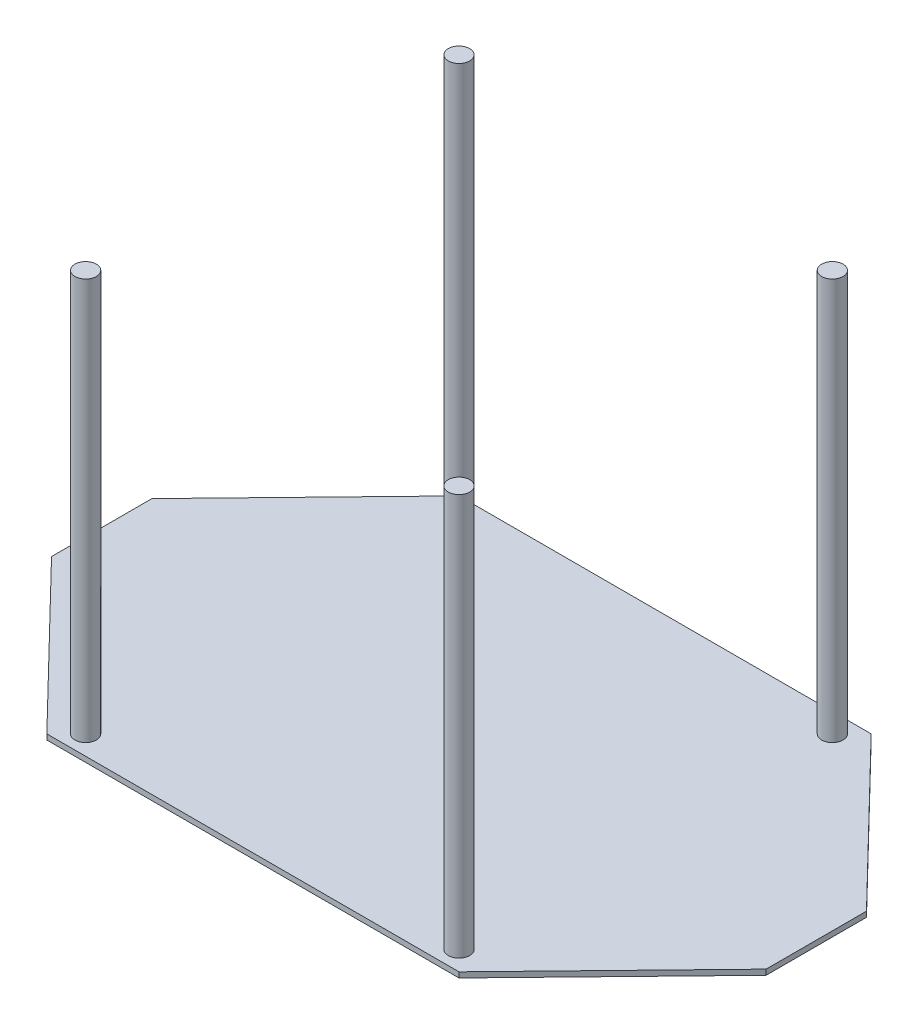
ISO-10303-21;
HEADER;
FILE_DESCRIPTION(('STEP AP214'),'2;1');
FILE_NAME('part.step','',(''),(''),'','','');
FILE_SCHEMA(('AUTOMOTIVE_DESIGN { 1 0 10303 214 1 1 1 1 }'));
ENDSEC;
DATA;
#1=APPLICATION_CONTEXT('core data for automotive mechanical design processes');
#2=APPLICATION_PROTOCOL_DEFINITION('international standard','automotive_design',2000,#1);
#3=PRODUCT_CONTEXT('',#1,'mechanical');
#4=PRODUCT('Part','Part','',(#3));
#5=PRODUCT_RELATED_PRODUCT_CATEGORY('part','',(#4));
#6=PRODUCT_DEFINITION_FORMATION('','',#4);
#7=PRODUCT_DEFINITION_CONTEXT('part definition',#1,'design');
#8=PRODUCT_DEFINITION('design','',#6,#7);
#9=PRODUCT_DEFINITION_SHAPE('','',#8);
#10=(LENGTH_UNIT() NAMED_UNIT(*) SI_UNIT(.MILLI.,.METRE.));
#11=(NAMED_UNIT(*) PLANE_ANGLE_UNIT() SI_UNIT($,.RADIAN.));
#12=(NAMED_UNIT(*) SI_UNIT($,.STERADIAN.) SOLID_ANGLE_UNIT());
#13=UNCERTAINTY_MEASURE_WITH_UNIT(LENGTH_MEASURE(1.E-05),#10,'distance_accuracy_value','');
#14=(GEOMETRIC_REPRESENTATION_CONTEXT(3) GLOBAL_UNCERTAINTY_ASSIGNED_CONTEXT((#13)) GLOBAL_UNIT_ASSIGNED_CONTEXT((#10,
#11,#12)) REPRESENTATION_CONTEXT('',''));
#15=CARTESIAN_POINT('',(0.,0.,0.));
#16=DIRECTION('',(0.,0.,1.));
#17=DIRECTION('',(1.,0.,0.));
#18=AXIS2_PLACEMENT_3D('',#15,#16,#17);
#19=CARTESIAN_POINT('',(-267.,-4.,-37.5));
#20=DIRECTION('',(-0.717807076120682,0.,-0.696242056666413));
#21=DIRECTION('',(-0.696242056666413,0.,0.717807076120682));
#22=AXIS2_PLACEMENT_3D('',#19,#20,#21);
#23=PLANE('',#22);
#24=DIRECTION('',(-0.696242056666413,0.,0.717807076120682));
#25=VECTOR('',#24,1.);
#26=CARTESIAN_POINT('',(-267.,0.,-37.5));
#27=LINE('',#26,#25);
#28=CARTESIAN_POINT('',(-154.,0.,-154.));
#29=VERTEX_POINT('',#28);
#30=CARTESIAN_POINT('',(-267.,0.,-37.5));
#31=VERTEX_POINT('',#30);
#32=EDGE_CURVE('E142',#29,#31,#27,.T.);
#33=ORIENTED_EDGE('',*,*,#32,.F.);
#34=DIRECTION('',(0.,1.,0.));
#35=VECTOR('',#34,1.);
#36=CARTESIAN_POINT('',(-154.,-4.,-154.));
#37=LINE('',#36,#35);
#38=CARTESIAN_POINT('',(-154.,-4.,-154.));
#39=VERTEX_POINT('',#38);
#40=EDGE_CURVE('E11',#39,#29,#37,.T.);
#41=ORIENTED_EDGE('',*,*,#40,.F.);
#42=DIRECTION('',(-0.696242056666413,0.,0.717807076120682));
#43=VECTOR('',#42,1.);
#44=CARTESIAN_POINT('',(-267.,-4.,-37.5));
#45=LINE('',#44,#43);
#46=CARTESIAN_POINT('',(-267.,-4.,-37.5));
#47=VERTEX_POINT('',#46);
#48=EDGE_CURVE('E171',#39,#47,#45,.T.);
#49=ORIENTED_EDGE('',*,*,#48,.T.);
#50=DIRECTION('',(0.,1.,0.));
#51=VECTOR('',#50,1.);
#52=CARTESIAN_POINT('',(-267.,-4.,-37.5));
#53=LINE('',#52,#51);
#54=EDGE_CURVE('E42',#47,#31,#53,.T.);
#55=ORIENTED_EDGE('',*,*,#54,.T.);
#56=EDGE_LOOP('',(#33,#41,#49,#55));
#57=FACE_BOUND('',#56,.T.);
#58=ADVANCED_FACE('F39',(#57),#23,.T.);
#59=CARTESIAN_POINT('',(154.,-4.,-154.));
#60=DIRECTION('',(0.,0.,-1.));
#61=DIRECTION('',(-1.,0.,0.));
#62=AXIS2_PLACEMENT_3D('',#59,#60,#61);
#63=PLANE('',#62);
#64=DIRECTION('',(-1.,0.,0.));
#65=VECTOR('',#64,1.);
#66=CARTESIAN_POINT('',(154.,0.,-154.));
#67=LINE('',#66,#65);
#68=CARTESIAN_POINT('',(154.,0.,-154.));
#69=VERTEX_POINT('',#68);
#70=EDGE_CURVE('E168',#69,#29,#67,.T.);
#71=ORIENTED_EDGE('',*,*,#70,.F.);
#72=DIRECTION('',(0.,1.,0.));
#73=VECTOR('',#72,1.);
#74=CARTESIAN_POINT('',(154.,-4.,-154.));
#75=LINE('',#74,#73);
#76=CARTESIAN_POINT('',(154.,-4.,-154.));
#77=VERTEX_POINT('',#76);
#78=EDGE_CURVE('E49',#77,#69,#75,.T.);
#79=ORIENTED_EDGE('',*,*,#78,.F.);
#80=DIRECTION('',(-1.,0.,0.));
#81=VECTOR('',#80,1.);
#82=CARTESIAN_POINT('',(154.,-4.,-154.));
#83=LINE('',#82,#81);
#84=EDGE_CURVE('E128',#77,#39,#83,.T.);
#85=ORIENTED_EDGE('',*,*,#84,.T.);
#86=ORIENTED_EDGE('',*,*,#40,.T.);
#87=EDGE_LOOP('',(#71,#79,#85,#86));
#88=FACE_BOUND('',#87,.T.);
#89=ADVANCED_FACE('F189',(#88),#63,.T.);
#90=CARTESIAN_POINT('',(267.,-4.,-37.5));
#91=DIRECTION('',(0.717807076120683,0.,-0.696242056666413));
#92=DIRECTION('',(-0.696242056666413,0.,-0.717807076120683));
#93=AXIS2_PLACEMENT_3D('',#90,#91,#92);
#94=PLANE('',#93);
#95=DIRECTION('',(-0.696242056666413,0.,-0.717807076120683));
#96=VECTOR('',#95,1.);
#97=CARTESIAN_POINT('',(267.,0.,-37.5));
#98=LINE('',#97,#96);
#99=CARTESIAN_POINT('',(267.,0.,-37.5));
#100=VERTEX_POINT('',#99);
#101=EDGE_CURVE('E114',#100,#69,#98,.T.);
#102=ORIENTED_EDGE('',*,*,#101,.F.);
#103=DIRECTION('',(0.,1.,0.));
#104=VECTOR('',#103,1.);
#105=CARTESIAN_POINT('',(267.,-4.,-37.5));
#106=LINE('',#105,#104);
#107=CARTESIAN_POINT('',(267.,-4.,-37.5));
#108=VERTEX_POINT('',#107);
#109=EDGE_CURVE('E109',#108,#100,#106,.T.);
#110=ORIENTED_EDGE('',*,*,#109,.F.);
#111=DIRECTION('',(-0.696242056666413,0.,-0.717807076120683));
#112=VECTOR('',#111,1.);
#113=CARTESIAN_POINT('',(267.,-4.,-37.5));
#114=LINE('',#113,#112);
#115=EDGE_CURVE('E112',#108,#77,#114,.T.);
#116=ORIENTED_EDGE('',*,*,#115,.T.);
#117=ORIENTED_EDGE('',*,*,#78,.T.);
#118=EDGE_LOOP('',(#102,#110,#116,#117));
#119=FACE_BOUND('',#118,.T.);
#120=ADVANCED_FACE('F111',(#119),#94,.T.);
#121=CARTESIAN_POINT('',(267.,-4.,37.5));
#122=DIRECTION('',(1.,0.,0.));
#123=DIRECTION('',(0.,0.,-1.));
#124=AXIS2_PLACEMENT_3D('',#121,#122,#123);
#125=PLANE('',#124);
#126=DIRECTION('',(0.,0.,-1.));
#127=VECTOR('',#126,1.);
#128=CARTESIAN_POINT('',(267.,0.,37.5));
#129=LINE('',#128,#127);
#130=CARTESIAN_POINT('',(267.,0.,37.5));
#131=VERTEX_POINT('',#130);
#132=EDGE_CURVE('E163',#131,#100,#129,.T.);
#133=ORIENTED_EDGE('',*,*,#132,.F.);
#134=DIRECTION('',(0.,1.,0.));
#135=VECTOR('',#134,1.);
#136=CARTESIAN_POINT('',(267.,-4.,37.5));
#137=LINE('',#136,#135);
#138=CARTESIAN_POINT('',(267.,-4.,37.5));
#139=VERTEX_POINT('',#138);
#140=EDGE_CURVE('E120',#139,#131,#137,.T.);
#141=ORIENTED_EDGE('',*,*,#140,.F.);
#142=DIRECTION('',(0.,0.,-1.));
#143=VECTOR('',#142,1.);
#144=CARTESIAN_POINT('',(267.,-4.,37.5));
#145=LINE('',#144,#143);
#146=EDGE_CURVE('E126',#139,#108,#145,.T.);
#147=ORIENTED_EDGE('',*,*,#146,.T.);
#148=ORIENTED_EDGE('',*,*,#109,.T.);
#149=EDGE_LOOP('',(#133,#141,#147,#148));
#150=FACE_BOUND('',#149,.T.);
#151=ADVANCED_FACE('F131',(#150),#125,.T.);
#152=CARTESIAN_POINT('',(267.,-4.,37.5));
#153=DIRECTION('',(0.717807076120682,0.,0.696242056666413));
#154=DIRECTION('',(0.696242056666413,0.,-0.717807076120682));
#155=AXIS2_PLACEMENT_3D('',#152,#153,#154);
#156=PLANE('',#155);
#157=DIRECTION('',(0.696242056666413,0.,-0.717807076120682));
#158=VECTOR('',#157,1.);
#159=CARTESIAN_POINT('',(267.,0.,37.5));
#160=LINE('',#159,#158);
#161=CARTESIAN_POINT('',(154.,0.,154.));
#162=VERTEX_POINT('',#161);
#163=EDGE_CURVE('E159',#162,#131,#160,.T.);
#164=ORIENTED_EDGE('',*,*,#163,.F.);
#165=DIRECTION('',(0.,1.,0.));
#166=VECTOR('',#165,1.);
#167=CARTESIAN_POINT('',(154.,-4.,154.));
#168=LINE('',#167,#166);
#169=CARTESIAN_POINT('',(154.,-4.,154.));
#170=VERTEX_POINT('',#169);
#171=EDGE_CURVE('E177',#170,#162,#168,.T.);
#172=ORIENTED_EDGE('',*,*,#171,.F.);
#173=DIRECTION('',(0.696242056666413,0.,-0.717807076120682));
#174=VECTOR('',#173,1.);
#175=CARTESIAN_POINT('',(267.,-4.,37.5));
#176=LINE('',#175,#174);
#177=EDGE_CURVE('E133',#170,#139,#176,.T.);
#178=ORIENTED_EDGE('',*,*,#177,.T.);
#179=ORIENTED_EDGE('',*,*,#140,.T.);
#180=EDGE_LOOP('',(#164,#172,#178,#179));
#181=FACE_BOUND('',#180,.T.);
#182=ADVANCED_FACE('F202',(#181),#156,.T.);
#183=CARTESIAN_POINT('',(154.,-4.,154.));
#184=DIRECTION('',(0.,0.,1.));
#185=DIRECTION('',(1.,0.,0.));
#186=AXIS2_PLACEMENT_3D('',#183,#184,#185);
#187=PLANE('',#186);
#188=DIRECTION('',(1.,0.,0.));
#189=VECTOR('',#188,1.);
#190=CARTESIAN_POINT('',(154.,0.,154.));
#191=LINE('',#190,#189);
#192=CARTESIAN_POINT('',(-154.,0.,154.));
#193=VERTEX_POINT('',#192);
#194=EDGE_CURVE('E155',#193,#162,#191,.T.);
#195=ORIENTED_EDGE('',*,*,#194,.F.);
#196=DIRECTION('',(0.,1.,0.));
#197=VECTOR('',#196,1.);
#198=CARTESIAN_POINT('',(-154.,-4.,154.));
#199=LINE('',#198,#197);
#200=CARTESIAN_POINT('',(-154.,-4.,154.));
#201=VERTEX_POINT('',#200);
#202=EDGE_CURVE('E180',#201,#193,#199,.T.);
#203=ORIENTED_EDGE('',*,*,#202,.F.);
#204=DIRECTION('',(1.,0.,0.));
#205=VECTOR('',#204,1.);
#206=CARTESIAN_POINT('',(154.,-4.,154.));
#207=LINE('',#206,#205);
#208=EDGE_CURVE('E136',#201,#170,#207,.T.);
#209=ORIENTED_EDGE('',*,*,#208,.T.);
#210=ORIENTED_EDGE('',*,*,#171,.T.);
#211=EDGE_LOOP('',(#195,#203,#209,#210));
#212=FACE_BOUND('',#211,.T.);
#213=ADVANCED_FACE('F205',(#212),#187,.T.);
#214=CARTESIAN_POINT('',(-267.,-4.,37.5));
#215=DIRECTION('',(-0.717807076120682,0.,0.696242056666413));
#216=DIRECTION('',(0.696242056666413,0.,0.717807076120682));
#217=AXIS2_PLACEMENT_3D('',#214,#215,#216);
#218=PLANE('',#217);
#219=DIRECTION('',(0.696242056666413,0.,0.717807076120682));
#220=VECTOR('',#219,1.);
#221=CARTESIAN_POINT('',(-267.,0.,37.5));
#222=LINE('',#221,#220);
#223=CARTESIAN_POINT('',(-267.,0.,37.5));
#224=VERTEX_POINT('',#223);
#225=EDGE_CURVE('E151',#224,#193,#222,.T.);
#226=ORIENTED_EDGE('',*,*,#225,.F.);
#227=DIRECTION('',(0.,1.,0.));
#228=VECTOR('',#227,1.);
#229=CARTESIAN_POINT('',(-267.,-4.,37.5));
#230=LINE('',#229,#228);
#231=CARTESIAN_POINT('',(-267.,-4.,37.5));
#232=VERTEX_POINT('',#231);
#233=EDGE_CURVE('E182',#232,#224,#230,.T.);
#234=ORIENTED_EDGE('',*,*,#233,.F.);
#235=DIRECTION('',(0.696242056666413,0.,0.717807076120682));
#236=VECTOR('',#235,1.);
#237=CARTESIAN_POINT('',(-267.,-4.,37.5));
#238=LINE('',#237,#236);
#239=EDGE_CURVE('E293',#232,#201,#238,.T.);
#240=ORIENTED_EDGE('',*,*,#239,.T.);
#241=ORIENTED_EDGE('',*,*,#202,.T.);
#242=EDGE_LOOP('',(#226,#234,#240,#241));
#243=FACE_BOUND('',#242,.T.);
#244=ADVANCED_FACE('F209',(#243),#218,.T.);
#245=CARTESIAN_POINT('',(-267.,-4.,37.5));
#246=DIRECTION('',(-1.,0.,0.));
#247=DIRECTION('',(0.,0.,1.));
#248=AXIS2_PLACEMENT_3D('',#245,#246,#247);
#249=PLANE('',#248);
#250=DIRECTION('',(0.,0.,1.));
#251=VECTOR('',#250,1.);
#252=CARTESIAN_POINT('',(-267.,0.,37.5));
#253=LINE('',#252,#251);
#254=EDGE_CURVE('E146',#31,#224,#253,.T.);
#255=ORIENTED_EDGE('',*,*,#254,.F.);
#256=ORIENTED_EDGE('',*,*,#54,.F.);
#257=DIRECTION('',(0.,0.,1.));
#258=VECTOR('',#257,1.);
#259=CARTESIAN_POINT('',(-267.,-4.,37.5));
#260=LINE('',#259,#258);
#261=EDGE_CURVE('E290',#47,#232,#260,.T.);
#262=ORIENTED_EDGE('',*,*,#261,.T.);
#263=ORIENTED_EDGE('',*,*,#233,.T.);
#264=EDGE_LOOP('',(#255,#256,#262,#263));
#265=FACE_BOUND('',#264,.T.);
#266=ADVANCED_FACE('F186',(#265),#249,.T.);
#267=CARTESIAN_POINT('',(0.,-4.,0.));
#268=DIRECTION('',(0.,1.,0.));
#269=DIRECTION('',(0.,0.,1.));
#270=AXIS2_PLACEMENT_3D('',#267,#268,#269);
#271=PLANE('',#270);
#272=ORIENTED_EDGE('',*,*,#48,.F.);
#273=ORIENTED_EDGE('',*,*,#84,.F.);
#274=ORIENTED_EDGE('',*,*,#115,.F.);
#275=ORIENTED_EDGE('',*,*,#146,.F.);
#276=ORIENTED_EDGE('',*,*,#177,.F.);
#277=ORIENTED_EDGE('',*,*,#208,.F.);
#278=ORIENTED_EDGE('',*,*,#239,.F.);
#279=ORIENTED_EDGE('',*,*,#261,.F.);
#280=EDGE_LOOP('',(#272,#273,#274,#275,#276,#277,#278,#279));
#281=FACE_BOUND('',#280,.T.);
#282=ADVANCED_FACE('F124',(#281),#271,.F.);
#283=CARTESIAN_POINT('',(0.,0.,0.));
#284=DIRECTION('',(0.,1.,0.));
#285=DIRECTION('',(0.,0.,1.));
#286=AXIS2_PLACEMENT_3D('',#283,#284,#285);
#287=PLANE('',#286);
#288=CARTESIAN_POINT('',(-139.5,0.,139.5));
#289=DIRECTION('',(0.,1.,0.));
#290=DIRECTION('',(0.,0.,-1.));
#291=AXIS2_PLACEMENT_3D('',#288,#289,#290);
#292=CIRCLE('',#291,8.);
#293=CARTESIAN_POINT('',(-139.5,0.,131.5));
#294=VERTEX_POINT('',#293);
#295=EDGE_CURVE('E260',#294,#294,#292,.T.);
#296=ORIENTED_EDGE('',*,*,#295,.F.);
#297=EDGE_LOOP('',(#296));
#298=FACE_BOUND('',#297,.T.);
#299=CARTESIAN_POINT('',(139.5,0.,139.5));
#300=DIRECTION('',(0.,1.,0.));
#301=DIRECTION('',(0.,0.,1.));
#302=AXIS2_PLACEMENT_3D('',#299,#300,#301);
#303=CIRCLE('',#302,8.00000000000002);
#304=CARTESIAN_POINT('',(139.5,0.,147.5));
#305=VERTEX_POINT('',#304);
#306=EDGE_CURVE('E259',#305,#305,#303,.T.);
#307=ORIENTED_EDGE('',*,*,#306,.F.);
#308=EDGE_LOOP('',(#307));
#309=FACE_BOUND('',#308,.T.);
#310=CARTESIAN_POINT('',(139.5,0.,-139.5));
#311=DIRECTION('',(0.,1.,0.));
#312=DIRECTION('',(0.,0.,-1.));
#313=AXIS2_PLACEMENT_3D('',#310,#311,#312);
#314=CIRCLE('',#313,8.00000000000002);
#315=CARTESIAN_POINT('',(139.5,0.,-147.5));
#316=VERTEX_POINT('',#315);
#317=EDGE_CURVE('E272',#316,#316,#314,.T.);
#318=ORIENTED_EDGE('',*,*,#317,.F.);
#319=EDGE_LOOP('',(#318));
#320=FACE_BOUND('',#319,.T.);
#321=CARTESIAN_POINT('',(-139.5,0.,-139.5));
#322=DIRECTION('',(0.,1.,0.));
#323=DIRECTION('',(0.,0.,1.));
#324=AXIS2_PLACEMENT_3D('',#321,#322,#323);
#325=CIRCLE('',#324,8.00000000000001);
#326=CARTESIAN_POINT('',(-139.5,0.,-131.5));
#327=VERTEX_POINT('',#326);
#328=EDGE_CURVE('E278',#327,#327,#325,.T.);
#329=ORIENTED_EDGE('',*,*,#328,.F.);
#330=EDGE_LOOP('',(#329));
#331=FACE_BOUND('',#330,.T.);
#332=ORIENTED_EDGE('',*,*,#32,.T.);
#333=ORIENTED_EDGE('',*,*,#254,.T.);
#334=ORIENTED_EDGE('',*,*,#225,.T.);
#335=ORIENTED_EDGE('',*,*,#194,.T.);
#336=ORIENTED_EDGE('',*,*,#163,.T.);
#337=ORIENTED_EDGE('',*,*,#132,.T.);
#338=ORIENTED_EDGE('',*,*,#101,.T.);
#339=ORIENTED_EDGE('',*,*,#70,.T.);
#340=EDGE_LOOP('',(#332,#333,#334,#335,#336,#337,#338,#339));
#341=FACE_BOUND('',#340,.T.);
#342=ADVANCED_FACE('F188',(#298,#309,#320,#331,#341),#287,.T.);
#343=CARTESIAN_POINT('',(-139.5,300.,-139.5));
#344=DIRECTION('',(0.,-1.,0.));
#345=DIRECTION('',(0.,0.,-1.));
#346=AXIS2_PLACEMENT_3D('',#343,#344,#345);
#347=CYLINDRICAL_SURFACE('',#346,8.00000000000001);
#348=CARTESIAN_POINT('',(-139.5,300.,-139.5));
#349=DIRECTION('',(0.,1.,0.));
#350=DIRECTION('',(0.,0.,1.));
#351=AXIS2_PLACEMENT_3D('',#348,#349,#350);
#352=CIRCLE('',#351,8.00000000000001);
#353=CARTESIAN_POINT('',(-139.5,300.,-131.5));
#354=VERTEX_POINT('',#353);
#355=EDGE_CURVE('E147',#354,#354,#352,.T.);
#356=ORIENTED_EDGE('',*,*,#355,.F.);
#357=EDGE_LOOP('',(#356));
#358=FACE_BOUND('',#357,.T.);
#359=ORIENTED_EDGE('',*,*,#328,.T.);
#360=EDGE_LOOP('',(#359));
#361=FACE_BOUND('',#360,.T.);
#362=ADVANCED_FACE('F220',(#358,#361),#347,.T.);
#363=CARTESIAN_POINT('',(-139.5,300.,-139.5));
#364=DIRECTION('',(0.,1.,0.));
#365=DIRECTION('',(0.,0.,1.));
#366=AXIS2_PLACEMENT_3D('',#363,#364,#365);
#367=PLANE('',#366);
#368=ORIENTED_EDGE('',*,*,#355,.T.);
#369=EDGE_LOOP('',(#368));
#370=FACE_BOUND('',#369,.T.);
#371=ADVANCED_FACE('F225',(#370),#367,.T.);
#372=CARTESIAN_POINT('',(139.5,300.,-139.5));
#373=DIRECTION('',(0.,-1.,0.));
#374=DIRECTION('',(0.,0.,-1.));
#375=AXIS2_PLACEMENT_3D('',#372,#373,#374);
#376=CYLINDRICAL_SURFACE('',#375,8.00000000000002);
#377=CARTESIAN_POINT('',(139.5,300.,-139.5));
#378=DIRECTION('',(0.,1.,0.));
#379=DIRECTION('',(0.,0.,-1.));
#380=AXIS2_PLACEMENT_3D('',#377,#378,#379);
#381=CIRCLE('',#380,8.00000000000002);
#382=CARTESIAN_POINT('',(139.5,300.,-147.5));
#383=VERTEX_POINT('',#382);
#384=EDGE_CURVE('E274',#383,#383,#381,.T.);
#385=ORIENTED_EDGE('',*,*,#384,.F.);
#386=EDGE_LOOP('',(#385));
#387=FACE_BOUND('',#386,.T.);
#388=ORIENTED_EDGE('',*,*,#317,.T.);
#389=EDGE_LOOP('',(#388));
#390=FACE_BOUND('',#389,.T.);
#391=ADVANCED_FACE('F229',(#387,#390),#376,.T.);
#392=CARTESIAN_POINT('',(139.5,300.,-139.5));
#393=DIRECTION('',(0.,-1.,0.));
#394=DIRECTION('',(0.,0.,-1.));
#395=AXIS2_PLACEMENT_3D('',#392,#393,#394);
#396=PLANE('',#395);
#397=ORIENTED_EDGE('',*,*,#384,.T.);
#398=EDGE_LOOP('',(#397));
#399=FACE_BOUND('',#398,.T.);
#400=ADVANCED_FACE('F233',(#399),#396,.F.);
#401=CARTESIAN_POINT('',(139.5,300.,139.5));
#402=DIRECTION('',(0.,-1.,0.));
#403=DIRECTION('',(0.,0.,-1.));
#404=AXIS2_PLACEMENT_3D('',#401,#402,#403);
#405=CYLINDRICAL_SURFACE('',#404,8.00000000000002);
#406=CARTESIAN_POINT('',(139.5,300.,139.5));
#407=DIRECTION('',(0.,1.,0.));
#408=DIRECTION('',(0.,0.,1.));
#409=AXIS2_PLACEMENT_3D('',#406,#407,#408);
#410=CIRCLE('',#409,8.00000000000002);
#411=CARTESIAN_POINT('',(139.5,300.,147.5));
#412=VERTEX_POINT('',#411);
#413=EDGE_CURVE('E265',#412,#412,#410,.T.);
#414=ORIENTED_EDGE('',*,*,#413,.F.);
#415=EDGE_LOOP('',(#414));
#416=FACE_BOUND('',#415,.T.);
#417=ORIENTED_EDGE('',*,*,#306,.T.);
#418=EDGE_LOOP('',(#417));
#419=FACE_BOUND('',#418,.T.);
#420=ADVANCED_FACE('F237',(#416,#419),#405,.T.);
#421=CARTESIAN_POINT('',(139.5,300.,139.5));
#422=DIRECTION('',(0.,1.,0.));
#423=DIRECTION('',(0.,0.,1.));
#424=AXIS2_PLACEMENT_3D('',#421,#422,#423);
#425=PLANE('',#424);
#426=ORIENTED_EDGE('',*,*,#413,.T.);
#427=EDGE_LOOP('',(#426));
#428=FACE_BOUND('',#427,.T.);
#429=ADVANCED_FACE('F241',(#428),#425,.T.);
#430=CARTESIAN_POINT('',(-139.5,300.,139.5));
#431=DIRECTION('',(0.,-1.,0.));
#432=DIRECTION('',(0.,0.,-1.));
#433=AXIS2_PLACEMENT_3D('',#430,#431,#432);
#434=CYLINDRICAL_SURFACE('',#433,8.);
#435=CARTESIAN_POINT('',(-139.5,300.,139.5));
#436=DIRECTION('',(0.,1.,0.));
#437=DIRECTION('',(0.,0.,-1.));
#438=AXIS2_PLACEMENT_3D('',#435,#436,#437);
#439=CIRCLE('',#438,8.);
#440=CARTESIAN_POINT('',(-139.5,300.,131.5));
#441=VERTEX_POINT('',#440);
#442=EDGE_CURVE('E257',#441,#441,#439,.T.);
#443=ORIENTED_EDGE('',*,*,#442,.F.);
#444=EDGE_LOOP('',(#443));
#445=FACE_BOUND('',#444,.T.);
#446=ORIENTED_EDGE('',*,*,#295,.T.);
#447=EDGE_LOOP('',(#446));
#448=FACE_BOUND('',#447,.T.);
#449=ADVANCED_FACE('F245',(#445,#448),#434,.T.);
#450=CARTESIAN_POINT('',(-139.5,300.,139.5));
#451=DIRECTION('',(0.,-1.,0.));
#452=DIRECTION('',(0.,0.,-1.));
#453=AXIS2_PLACEMENT_3D('',#450,#451,#452);
#454=PLANE('',#453);
#455=ORIENTED_EDGE('',*,*,#442,.T.);
#456=EDGE_LOOP('',(#455));
#457=FACE_BOUND('',#456,.T.);
#458=ADVANCED_FACE('F249',(#457),#454,.F.);
#459=CLOSED_SHELL('',(#58,#89,#120,#151,#182,#213,#244,#266,#282,#342,#362,#371,#391,#400,#420,
#429,#449,#458));
#460=MANIFOLD_SOLID_BREP('B2',#459);
#461=ADVANCED_BREP_SHAPE_REPRESENTATION('',(#18,#460),#14);
#462=SHAPE_DEFINITION_REPRESENTATION(#9,#461);
ENDSEC;
END-ISO-10303-21;
